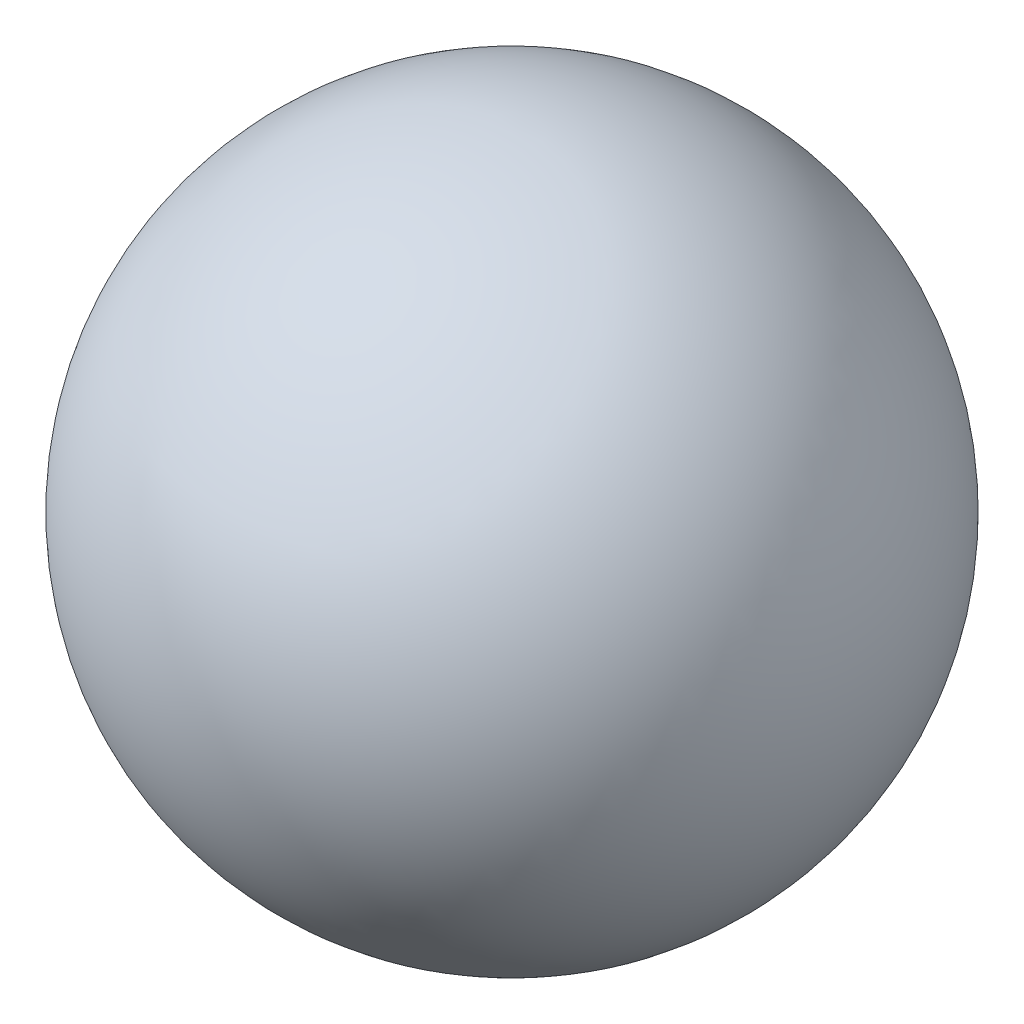
ISO-10303-21;
HEADER;
FILE_DESCRIPTION(('STEP AP214'),'2;1');
FILE_NAME('part.step','',(''),(''),'','','');
FILE_SCHEMA(('AUTOMOTIVE_DESIGN { 1 0 10303 214 1 1 1 1 }'));
ENDSEC;
DATA;
#1=APPLICATION_CONTEXT('core data for automotive mechanical design processes');
#2=APPLICATION_PROTOCOL_DEFINITION('international standard','automotive_design',2000,#1);
#3=PRODUCT_CONTEXT('',#1,'mechanical');
#4=PRODUCT('Part','Part','',(#3));
#5=PRODUCT_RELATED_PRODUCT_CATEGORY('part','',(#4));
#6=PRODUCT_DEFINITION_FORMATION('','',#4);
#7=PRODUCT_DEFINITION_CONTEXT('part definition',#1,'design');
#8=PRODUCT_DEFINITION('design','',#6,#7);
#9=PRODUCT_DEFINITION_SHAPE('','',#8);
#10=(LENGTH_UNIT() NAMED_UNIT(*) SI_UNIT(.MILLI.,.METRE.));
#11=(NAMED_UNIT(*) PLANE_ANGLE_UNIT() SI_UNIT($,.RADIAN.));
#12=(NAMED_UNIT(*) SI_UNIT($,.STERADIAN.) SOLID_ANGLE_UNIT());
#13=UNCERTAINTY_MEASURE_WITH_UNIT(LENGTH_MEASURE(1.E-05),#10,'distance_accuracy_value','');
#14=(GEOMETRIC_REPRESENTATION_CONTEXT(3) GLOBAL_UNCERTAINTY_ASSIGNED_CONTEXT((#13)) GLOBAL_UNIT_ASSIGNED_CONTEXT((#10,
#11,#12)) REPRESENTATION_CONTEXT('',''));
#15=CARTESIAN_POINT('',(0.,0.,0.));
#16=DIRECTION('',(0.,0.,1.));
#17=DIRECTION('',(1.,0.,0.));
#18=AXIS2_PLACEMENT_3D('',#15,#16,#17);
#19=CARTESIAN_POINT('',(0.,-60.,0.));
#20=DIRECTION('',(0.,1.,0.));
#21=DIRECTION('',(0.,0.,-1.));
#22=AXIS2_PLACEMENT_3D('',#19,#20,#21);
#23=SPHERICAL_SURFACE('',#22,70.);
#24=CARTESIAN_POINT('',(0.,10.,0.));
#25=VERTEX_POINT('',#24);
#26=VERTEX_LOOP('',#25);
#27=FACE_BOUND('',#26,.T.);
#28=ADVANCED_FACE('F30',(#27),#23,.T.);
#29=CLOSED_SHELL('',(#28));
#30=CARTESIAN_POINT('',(0.,-60.,0.));
#31=DIRECTION('',(0.,1.,0.));
#32=DIRECTION('',(0.,0.,1.));
#33=AXIS2_PLACEMENT_3D('',#30,#31,#32);
#34=SPHERICAL_SURFACE('',#33,60.);
#35=CARTESIAN_POINT('',(0.,0.,0.));
#36=VERTEX_POINT('',#35);
#37=VERTEX_LOOP('',#36);
#38=FACE_BOUND('',#37,.T.);
#39=ADVANCED_FACE('F32',(#38),#34,.F.);
#40=CLOSED_SHELL('',(#39));
#41=ORIENTED_CLOSED_SHELL('',*,#40,.T.);
#42=BREP_WITH_VOIDS('B2',#29,(#41));
#43=ADVANCED_BREP_SHAPE_REPRESENTATION('',(#18,#42),#14);
#44=SHAPE_DEFINITION_REPRESENTATION(#9,#43);
ENDSEC;
END-ISO-10303-21;
